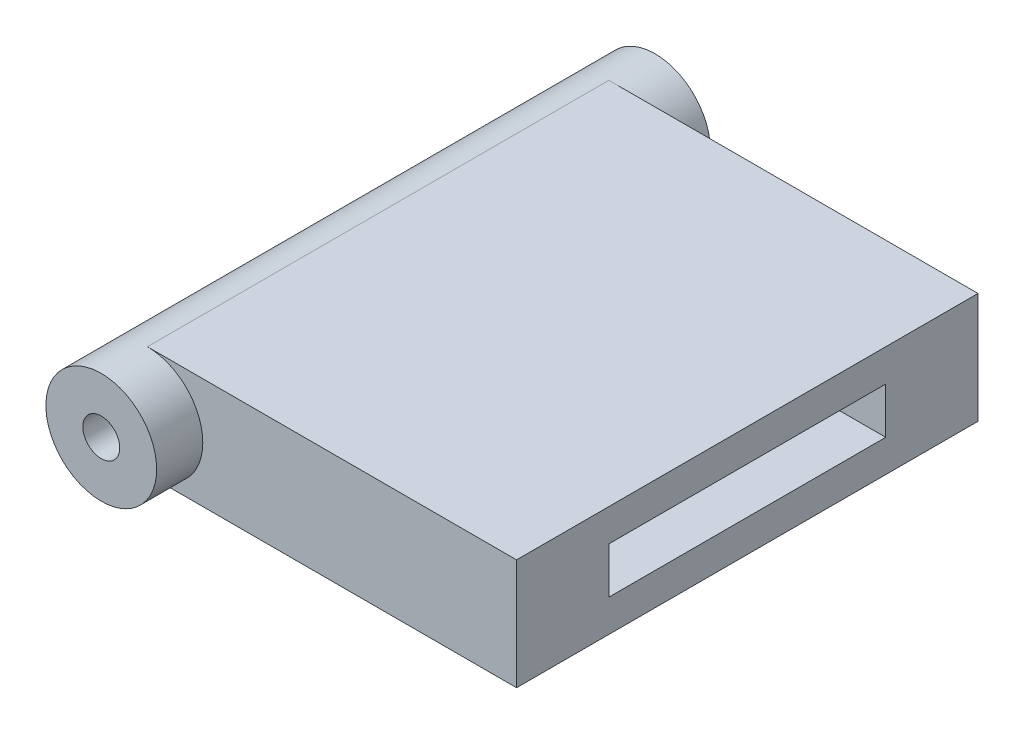
ISO-10303-21;
HEADER;
FILE_DESCRIPTION(('STEP AP214'),'2;1');
FILE_NAME('part.step','',(''),(''),'','','');
FILE_SCHEMA(('AUTOMOTIVE_DESIGN { 1 0 10303 214 1 1 1 1 }'));
ENDSEC;
DATA;
#1=APPLICATION_CONTEXT('core data for automotive mechanical design processes');
#2=APPLICATION_PROTOCOL_DEFINITION('international standard','automotive_design',2000,#1);
#3=PRODUCT_CONTEXT('',#1,'mechanical');
#4=PRODUCT('Part','Part','',(#3));
#5=PRODUCT_RELATED_PRODUCT_CATEGORY('part','',(#4));
#6=PRODUCT_DEFINITION_FORMATION('','',#4);
#7=PRODUCT_DEFINITION_CONTEXT('part definition',#1,'design');
#8=PRODUCT_DEFINITION('design','',#6,#7);
#9=PRODUCT_DEFINITION_SHAPE('','',#8);
#10=(LENGTH_UNIT() NAMED_UNIT(*) SI_UNIT(.MILLI.,.METRE.));
#11=(NAMED_UNIT(*) PLANE_ANGLE_UNIT() SI_UNIT($,.RADIAN.));
#12=(NAMED_UNIT(*) SI_UNIT($,.STERADIAN.) SOLID_ANGLE_UNIT());
#13=UNCERTAINTY_MEASURE_WITH_UNIT(LENGTH_MEASURE(1.E-05),#10,'distance_accuracy_value','');
#14=(GEOMETRIC_REPRESENTATION_CONTEXT(3) GLOBAL_UNCERTAINTY_ASSIGNED_CONTEXT((#13)) GLOBAL_UNIT_ASSIGNED_CONTEXT((#10,
#11,#12)) REPRESENTATION_CONTEXT('',''));
#15=CARTESIAN_POINT('',(0.,0.,0.));
#16=DIRECTION('',(0.,0.,1.));
#17=DIRECTION('',(1.,0.,0.));
#18=AXIS2_PLACEMENT_3D('',#15,#16,#17);
#19=CARTESIAN_POINT('',(0.,0.,76.2));
#20=DIRECTION('',(0.,0.,-1.));
#21=DIRECTION('',(-1.,0.,0.));
#22=AXIS2_PLACEMENT_3D('',#19,#20,#21);
#23=CYLINDRICAL_SURFACE('',#22,2.54);
#24=CARTESIAN_POINT('',(0.,0.,76.2));
#25=DIRECTION('',(0.,0.,1.));
#26=DIRECTION('',(1.,0.,0.));
#27=AXIS2_PLACEMENT_3D('',#24,#25,#26);
#28=CIRCLE('',#27,2.54);
#29=CARTESIAN_POINT('',(-2.54,0.,76.2));
#30=VERTEX_POINT('',#29);
#31=EDGE_CURVE('E204',#30,#30,#28,.T.);
#32=CARTESIAN_POINT('',(0.,0.,0.));
#33=DIRECTION('',(0.,0.,1.));
#34=DIRECTION('',(1.,0.,0.));
#35=AXIS2_PLACEMENT_3D('',#32,#33,#34);
#36=CIRCLE('',#35,2.54);
#37=CARTESIAN_POINT('',(-2.54,0.,0.));
#38=VERTEX_POINT('',#37);
#39=EDGE_CURVE('E203',#38,#38,#36,.T.);
#40=CARTESIAN_POINT('',(-2.54,0.,76.2));
#41=CARTESIAN_POINT('',(-2.54,0.,75.40625));
#42=CARTESIAN_POINT('',(-2.54,0.,74.6125));
#43=CARTESIAN_POINT('',(-2.54,0.,73.025));
#44=CARTESIAN_POINT('',(-2.54,0.,72.23125));
#45=CARTESIAN_POINT('',(-2.54,0.,70.64375));
#46=CARTESIAN_POINT('',(-2.54,0.,69.85));
#47=CARTESIAN_POINT('',(-2.54,0.,68.2625));
#48=CARTESIAN_POINT('',(-2.54,0.,67.46875));
#49=CARTESIAN_POINT('',(-2.54,0.,65.88125));
#50=CARTESIAN_POINT('',(-2.54,0.,65.0875));
#51=CARTESIAN_POINT('',(-2.54,0.,63.5));
#52=CARTESIAN_POINT('',(-2.54,0.,62.70625));
#53=CARTESIAN_POINT('',(-2.54,0.,61.11875));
#54=CARTESIAN_POINT('',(-2.54,0.,60.325));
#55=CARTESIAN_POINT('',(-2.54,0.,58.7375));
#56=CARTESIAN_POINT('',(-2.54,0.,57.94375));
#57=CARTESIAN_POINT('',(-2.54,0.,56.35625));
#58=CARTESIAN_POINT('',(-2.54,0.,55.5625));
#59=CARTESIAN_POINT('',(-2.54,0.,53.975));
#60=CARTESIAN_POINT('',(-2.54,0.,53.18125));
#61=CARTESIAN_POINT('',(-2.54,0.,51.59375));
#62=CARTESIAN_POINT('',(-2.54,0.,50.8));
#63=CARTESIAN_POINT('',(-2.54,0.,49.2125));
#64=CARTESIAN_POINT('',(-2.54,0.,48.41875));
#65=CARTESIAN_POINT('',(-2.54,0.,46.83125));
#66=CARTESIAN_POINT('',(-2.54,0.,46.0375));
#67=CARTESIAN_POINT('',(-2.54,0.,44.45));
#68=CARTESIAN_POINT('',(-2.54,0.,43.65625));
#69=CARTESIAN_POINT('',(-2.54,0.,42.06875));
#70=CARTESIAN_POINT('',(-2.54,0.,41.275));
#71=CARTESIAN_POINT('',(-2.54,0.,39.6875));
#72=CARTESIAN_POINT('',(-2.54,0.,38.89375));
#73=CARTESIAN_POINT('',(-2.54,0.,37.30625));
#74=CARTESIAN_POINT('',(-2.54,0.,36.5125));
#75=CARTESIAN_POINT('',(-2.54,0.,34.925));
#76=CARTESIAN_POINT('',(-2.54,0.,34.13125));
#77=CARTESIAN_POINT('',(-2.54,0.,32.54375));
#78=CARTESIAN_POINT('',(-2.54,0.,31.75));
#79=CARTESIAN_POINT('',(-2.54,0.,30.1625));
#80=CARTESIAN_POINT('',(-2.54,0.,29.36875));
#81=CARTESIAN_POINT('',(-2.54,0.,27.78125));
#82=CARTESIAN_POINT('',(-2.54,0.,26.9875));
#83=CARTESIAN_POINT('',(-2.54,0.,25.4));
#84=CARTESIAN_POINT('',(-2.54,0.,24.60625));
#85=CARTESIAN_POINT('',(-2.54,0.,23.01875));
#86=CARTESIAN_POINT('',(-2.54,0.,22.225));
#87=CARTESIAN_POINT('',(-2.54,0.,20.6375));
#88=CARTESIAN_POINT('',(-2.54,0.,19.84375));
#89=CARTESIAN_POINT('',(-2.54,0.,18.25625));
#90=CARTESIAN_POINT('',(-2.54,0.,17.4625));
#91=CARTESIAN_POINT('',(-2.54,0.,15.875));
#92=CARTESIAN_POINT('',(-2.54,0.,15.08125));
#93=CARTESIAN_POINT('',(-2.54,0.,13.49375));
#94=CARTESIAN_POINT('',(-2.54,0.,12.7));
#95=CARTESIAN_POINT('',(-2.54,0.,11.1125));
#96=CARTESIAN_POINT('',(-2.54,0.,10.31875));
#97=CARTESIAN_POINT('',(-2.54,0.,8.73125));
#98=CARTESIAN_POINT('',(-2.54,0.,7.93750000000001));
#99=CARTESIAN_POINT('',(-2.54,0.,6.35));
#100=CARTESIAN_POINT('',(-2.54,0.,5.55625));
#101=CARTESIAN_POINT('',(-2.54,0.,3.96875));
#102=CARTESIAN_POINT('',(-2.54,0.,3.175));
#103=CARTESIAN_POINT('',(-2.54,0.,1.5875));
#104=CARTESIAN_POINT('',(-2.54,0.,0.793750000000001));
#105=CARTESIAN_POINT('',(-2.54,0.,0.));
#106=B_SPLINE_CURVE_WITH_KNOTS('',3,(#40,#41,#42,#43,#44,#45,#46,#47,#48,#49,#50,#51,#52,#53,
#54,#55,#56,#57,#58,#59,#60,#61,#62,#63,#64,#65,#66,#67,#68,#69,#70,#71,#72,#73,#74,#75,#76,#77,
#78,#79,#80,#81,#82,#83,#84,#85,#86,#87,#88,#89,#90,#91,#92,#93,#94,#95,#96,#97,#98,#99,#100,
#101,#102,#103,#104,#105),.UNSPECIFIED.,.F.,.F.,(4,2,2,2,2,2,2,2,2,2,2,2,2,2,2,2,2,2,2,2,2,2,2,
2,2,2,2,2,2,2,2,2,4),(0.,2.38124999999999,4.76249999999999,7.14374999999999,9.52499999999999,
11.90625,14.2875,16.66875,19.05,21.43125,23.8125,26.19375,28.575,30.95625,33.3375,35.71875,38.1,
40.48125,42.8625,45.24375,47.625,50.00625,52.3875,54.76875,57.15,59.53125,61.9125,64.29375,
66.675,69.05625,71.4375,73.81875,76.2),.UNSPECIFIED.);
#107=EDGE_CURVE('BSEAM45',#30,#38,#106,.T.);
#108=ORIENTED_EDGE('',*,*,#31,.T.);
#109=ORIENTED_EDGE('',*,*,#39,.F.);
#110=ORIENTED_EDGE('',*,*,#107,.T.);
#111=ORIENTED_EDGE('',*,*,#107,.F.);
#112=EDGE_LOOP('',(#108,#110,#109,#111));
#113=FACE_BOUND('',#112,.T.);
#114=ADVANCED_FACE('F45',(#113),#23,.F.);
#115=CARTESIAN_POINT('',(0.,0.,76.2));
#116=DIRECTION('',(0.,0.,1.));
#117=DIRECTION('',(1.,0.,0.));
#118=AXIS2_PLACEMENT_3D('',#115,#116,#117);
#119=PLANE('',#118);
#120=CARTESIAN_POINT('',(0.,0.,76.2));
#121=DIRECTION('',(0.,0.,1.));
#122=DIRECTION('',(1.,0.,0.));
#123=AXIS2_PLACEMENT_3D('',#120,#121,#122);
#124=CIRCLE('',#123,7.62);
#125=CARTESIAN_POINT('',(7.62,0.,76.2));
#126=VERTEX_POINT('',#125);
#127=EDGE_CURVE('E11',#126,#126,#124,.T.);
#128=ORIENTED_EDGE('',*,*,#127,.T.);
#129=EDGE_LOOP('',(#128));
#130=FACE_BOUND('',#129,.T.);
#131=ORIENTED_EDGE('',*,*,#31,.F.);
#132=EDGE_LOOP('',(#131));
#133=FACE_BOUND('',#132,.T.);
#134=ADVANCED_FACE('F215',(#130,#133),#119,.T.);
#135=CARTESIAN_POINT('',(0.,0.,0.));
#136=DIRECTION('',(0.,0.,1.));
#137=DIRECTION('',(1.,0.,0.));
#138=AXIS2_PLACEMENT_3D('',#135,#136,#137);
#139=PLANE('',#138);
#140=CARTESIAN_POINT('',(0.,0.,0.));
#141=DIRECTION('',(0.,0.,1.));
#142=DIRECTION('',(1.,0.,0.));
#143=AXIS2_PLACEMENT_3D('',#140,#141,#142);
#144=CIRCLE('',#143,7.62);
#145=CARTESIAN_POINT('',(7.62,0.,0.));
#146=VERTEX_POINT('',#145);
#147=EDGE_CURVE('E49',#146,#146,#144,.T.);
#148=ORIENTED_EDGE('',*,*,#147,.F.);
#149=EDGE_LOOP('',(#148));
#150=FACE_BOUND('',#149,.T.);
#151=ORIENTED_EDGE('',*,*,#39,.T.);
#152=EDGE_LOOP('',(#151));
#153=FACE_BOUND('',#152,.T.);
#154=ADVANCED_FACE('F212',(#150,#153),#139,.F.);
#155=CARTESIAN_POINT('',(0.,0.,76.2));
#156=DIRECTION('',(0.,0.,-1.));
#157=DIRECTION('',(-1.,0.,0.));
#158=AXIS2_PLACEMENT_3D('',#155,#156,#157);
#159=CYLINDRICAL_SURFACE('',#158,7.62);
#160=DIRECTION('',(0.,0.,1.));
#161=VECTOR('',#160,1.);
#162=CARTESIAN_POINT('',(0.,7.62,0.));
#163=LINE('',#162,#161);
#164=CARTESIAN_POINT('',(0.,7.62,6.35000000000002));
#165=VERTEX_POINT('',#164);
#166=CARTESIAN_POINT('',(0.,7.62,69.85));
#167=VERTEX_POINT('',#166);
#168=EDGE_CURVE('E156',#165,#167,#163,.T.);
#169=ORIENTED_EDGE('',*,*,#168,.F.);
#170=CARTESIAN_POINT('',(0.,0.,6.35000000000002));
#171=DIRECTION('',(0.,0.,-1.));
#172=DIRECTION('',(-1.,0.,0.));
#173=AXIS2_PLACEMENT_3D('',#170,#171,#172);
#174=CIRCLE('',#173,7.62);
#175=CARTESIAN_POINT('',(0.,-7.62,6.35000000000002));
#176=VERTEX_POINT('',#175);
#177=EDGE_CURVE('E69',#165,#176,#174,.T.);
#178=ORIENTED_EDGE('',*,*,#177,.T.);
#179=DIRECTION('',(0.,0.,-1.));
#180=VECTOR('',#179,1.);
#181=CARTESIAN_POINT('',(0.,-7.62,0.));
#182=LINE('',#181,#180);
#183=CARTESIAN_POINT('',(0.,-7.62,69.85));
#184=VERTEX_POINT('',#183);
#185=EDGE_CURVE('E167',#184,#176,#182,.T.);
#186=ORIENTED_EDGE('',*,*,#185,.F.);
#187=CARTESIAN_POINT('',(0.,0.,69.85));
#188=DIRECTION('',(0.,0.,-1.));
#189=DIRECTION('',(-1.,0.,0.));
#190=AXIS2_PLACEMENT_3D('',#187,#188,#189);
#191=CIRCLE('',#190,7.62);
#192=EDGE_CURVE('E197',#167,#184,#191,.T.);
#193=ORIENTED_EDGE('',*,*,#192,.F.);
#194=EDGE_LOOP('',(#169,#178,#186,#193));
#195=FACE_BOUND('',#194,.T.);
#196=ORIENTED_EDGE('',*,*,#127,.F.);
#197=EDGE_LOOP('',(#196));
#198=FACE_BOUND('',#197,.T.);
#199=ORIENTED_EDGE('',*,*,#147,.T.);
#200=EDGE_LOOP('',(#199));
#201=FACE_BOUND('',#200,.T.);
#202=ADVANCED_FACE('F47',(#195,#198,#201),#159,.T.);
#203=CARTESIAN_POINT('',(50.8,0.,6.35000000000002));
#204=DIRECTION('',(0.,0.,-1.));
#205=DIRECTION('',(-1.,0.,0.));
#206=AXIS2_PLACEMENT_3D('',#203,#204,#205);
#207=PLANE('',#206);
#208=ORIENTED_EDGE('',*,*,#177,.F.);
#209=DIRECTION('',(-1.,0.,0.));
#210=VECTOR('',#209,1.);
#211=CARTESIAN_POINT('',(50.8,7.62,6.35000000000002));
#212=LINE('',#211,#210);
#213=CARTESIAN_POINT('',(50.8,7.62,6.35000000000002));
#214=VERTEX_POINT('',#213);
#215=EDGE_CURVE('E193',#214,#165,#212,.T.);
#216=ORIENTED_EDGE('',*,*,#215,.F.);
#217=DIRECTION('',(0.,-1.,0.));
#218=VECTOR('',#217,1.);
#219=CARTESIAN_POINT('',(50.8,0.,6.35000000000002));
#220=LINE('',#219,#218);
#221=CARTESIAN_POINT('',(50.8,-7.62,6.35000000000002));
#222=VERTEX_POINT('',#221);
#223=EDGE_CURVE('E162',#214,#222,#220,.T.);
#224=ORIENTED_EDGE('',*,*,#223,.T.);
#225=DIRECTION('',(-1.,0.,0.));
#226=VECTOR('',#225,1.);
#227=CARTESIAN_POINT('',(50.8,-7.62,6.35000000000002));
#228=LINE('',#227,#226);
#229=EDGE_CURVE('E176',#222,#176,#228,.T.);
#230=ORIENTED_EDGE('',*,*,#229,.T.);
#231=EDGE_LOOP('',(#208,#216,#224,#230));
#232=FACE_BOUND('',#231,.T.);
#233=ADVANCED_FACE('F224',(#232),#207,.T.);
#234=CARTESIAN_POINT('',(50.8,7.62,0.));
#235=DIRECTION('',(0.,-1.,0.));
#236=DIRECTION('',(0.,0.,-1.));
#237=AXIS2_PLACEMENT_3D('',#234,#235,#236);
#238=PLANE('',#237);
#239=ORIENTED_EDGE('',*,*,#168,.T.);
#240=DIRECTION('',(-1.,0.,0.));
#241=VECTOR('',#240,1.);
#242=CARTESIAN_POINT('',(50.8,7.62,69.85));
#243=LINE('',#242,#241);
#244=CARTESIAN_POINT('',(50.8,7.62,69.85));
#245=VERTEX_POINT('',#244);
#246=EDGE_CURVE('E189',#245,#167,#243,.T.);
#247=ORIENTED_EDGE('',*,*,#246,.F.);
#248=DIRECTION('',(0.,0.,1.));
#249=VECTOR('',#248,1.);
#250=CARTESIAN_POINT('',(50.8,7.62,0.));
#251=LINE('',#250,#249);
#252=EDGE_CURVE('E166',#214,#245,#251,.T.);
#253=ORIENTED_EDGE('',*,*,#252,.F.);
#254=ORIENTED_EDGE('',*,*,#215,.T.);
#255=EDGE_LOOP('',(#239,#247,#253,#254));
#256=FACE_BOUND('',#255,.T.);
#257=ADVANCED_FACE('F238',(#256),#238,.F.);
#258=CARTESIAN_POINT('',(50.8,0.,69.85));
#259=DIRECTION('',(0.,0.,-1.));
#260=DIRECTION('',(-1.,0.,0.));
#261=AXIS2_PLACEMENT_3D('',#258,#259,#260);
#262=PLANE('',#261);
#263=ORIENTED_EDGE('',*,*,#246,.T.);
#264=ORIENTED_EDGE('',*,*,#192,.T.);
#265=DIRECTION('',(-1.,0.,0.));
#266=VECTOR('',#265,1.);
#267=CARTESIAN_POINT('',(50.8,-7.62,69.85));
#268=LINE('',#267,#266);
#269=CARTESIAN_POINT('',(50.8,-7.62,69.85));
#270=VERTEX_POINT('',#269);
#271=EDGE_CURVE('E185',#270,#184,#268,.T.);
#272=ORIENTED_EDGE('',*,*,#271,.F.);
#273=DIRECTION('',(0.,-1.,0.));
#274=VECTOR('',#273,1.);
#275=CARTESIAN_POINT('',(50.8,0.,69.85));
#276=LINE('',#275,#274);
#277=EDGE_CURVE('E170',#245,#270,#276,.T.);
#278=ORIENTED_EDGE('',*,*,#277,.F.);
#279=EDGE_LOOP('',(#263,#264,#272,#278));
#280=FACE_BOUND('',#279,.T.);
#281=ADVANCED_FACE('F257',(#280),#262,.F.);
#282=CARTESIAN_POINT('',(50.8,-7.62,0.));
#283=DIRECTION('',(0.,1.,0.));
#284=DIRECTION('',(0.,0.,1.));
#285=AXIS2_PLACEMENT_3D('',#282,#283,#284);
#286=PLANE('',#285);
#287=ORIENTED_EDGE('',*,*,#185,.T.);
#288=ORIENTED_EDGE('',*,*,#229,.F.);
#289=DIRECTION('',(0.,0.,-1.));
#290=VECTOR('',#289,1.);
#291=CARTESIAN_POINT('',(50.8,-7.62,0.));
#292=LINE('',#291,#290);
#293=EDGE_CURVE('E173',#270,#222,#292,.T.);
#294=ORIENTED_EDGE('',*,*,#293,.F.);
#295=ORIENTED_EDGE('',*,*,#271,.T.);
#296=EDGE_LOOP('',(#287,#288,#294,#295));
#297=FACE_BOUND('',#296,.T.);
#298=ADVANCED_FACE('F255',(#297),#286,.F.);
#299=CARTESIAN_POINT('',(50.8,0.,0.));
#300=DIRECTION('',(1.,0.,0.));
#301=DIRECTION('',(0.,0.,-1.));
#302=AXIS2_PLACEMENT_3D('',#299,#300,#301);
#303=PLANE('',#302);
#304=DIRECTION('',(0.,1.,0.));
#305=VECTOR('',#304,1.);
#306=CARTESIAN_POINT('',(50.8,3.175,19.05));
#307=LINE('',#306,#305);
#308=CARTESIAN_POINT('',(50.8,-3.175,19.05));
#309=VERTEX_POINT('',#308);
#310=CARTESIAN_POINT('',(50.8,3.175,19.05));
#311=VERTEX_POINT('',#310);
#312=EDGE_CURVE('E61',#309,#311,#307,.T.);
#313=ORIENTED_EDGE('',*,*,#312,.F.);
#314=DIRECTION('',(0.,0.,-1.));
#315=VECTOR('',#314,1.);
#316=CARTESIAN_POINT('',(50.8,-3.17500000000002,57.15));
#317=LINE('',#316,#315);
#318=CARTESIAN_POINT('',(50.8,-3.17500000000002,57.15));
#319=VERTEX_POINT('',#318);
#320=EDGE_CURVE('E134',#319,#309,#317,.T.);
#321=ORIENTED_EDGE('',*,*,#320,.F.);
#322=DIRECTION('',(0.,-1.,0.));
#323=VECTOR('',#322,1.);
#324=CARTESIAN_POINT('',(50.8,3.17499999999998,57.15));
#325=LINE('',#324,#323);
#326=CARTESIAN_POINT('',(50.8,3.17499999999998,57.15));
#327=VERTEX_POINT('',#326);
#328=EDGE_CURVE('E138',#327,#319,#325,.T.);
#329=ORIENTED_EDGE('',*,*,#328,.F.);
#330=DIRECTION('',(0.,0.,1.));
#331=VECTOR('',#330,1.);
#332=CARTESIAN_POINT('',(50.8,3.17499999999998,57.15));
#333=LINE('',#332,#331);
#334=EDGE_CURVE('E147',#311,#327,#333,.T.);
#335=ORIENTED_EDGE('',*,*,#334,.F.);
#336=EDGE_LOOP('',(#313,#321,#329,#335));
#337=FACE_BOUND('',#336,.T.);
#338=ORIENTED_EDGE('',*,*,#223,.F.);
#339=ORIENTED_EDGE('',*,*,#252,.T.);
#340=ORIENTED_EDGE('',*,*,#277,.T.);
#341=ORIENTED_EDGE('',*,*,#293,.T.);
#342=EDGE_LOOP('',(#338,#339,#340,#341));
#343=FACE_BOUND('',#342,.T.);
#344=ADVANCED_FACE('F251',(#337,#343),#303,.T.);
#345=CARTESIAN_POINT('',(25.4,3.175,19.05));
#346=DIRECTION('',(0.,0.,-1.));
#347=DIRECTION('',(-1.,0.,0.));
#348=AXIS2_PLACEMENT_3D('',#345,#346,#347);
#349=PLANE('',#348);
#350=ORIENTED_EDGE('',*,*,#312,.T.);
#351=DIRECTION('',(1.,0.,0.));
#352=VECTOR('',#351,1.);
#353=CARTESIAN_POINT('',(25.4,3.175,19.05));
#354=LINE('',#353,#352);
#355=CARTESIAN_POINT('',(25.4,3.175,19.05));
#356=VERTEX_POINT('',#355);
#357=EDGE_CURVE('E109',#356,#311,#354,.T.);
#358=ORIENTED_EDGE('',*,*,#357,.F.);
#359=DIRECTION('',(0.,1.,0.));
#360=VECTOR('',#359,1.);
#361=CARTESIAN_POINT('',(25.4,3.175,19.05));
#362=LINE('',#361,#360);
#363=CARTESIAN_POINT('',(25.4,-3.175,19.05));
#364=VERTEX_POINT('',#363);
#365=EDGE_CURVE('E113',#364,#356,#362,.T.);
#366=ORIENTED_EDGE('',*,*,#365,.F.);
#367=DIRECTION('',(1.,0.,0.));
#368=VECTOR('',#367,1.);
#369=CARTESIAN_POINT('',(25.4,-3.175,19.05));
#370=LINE('',#369,#368);
#371=EDGE_CURVE('E153',#364,#309,#370,.T.);
#372=ORIENTED_EDGE('',*,*,#371,.T.);
#373=EDGE_LOOP('',(#350,#358,#366,#372));
#374=FACE_BOUND('',#373,.T.);
#375=ADVANCED_FACE('F111',(#374),#349,.F.);
#376=CARTESIAN_POINT('',(25.4,-3.17500000000002,57.15));
#377=DIRECTION('',(0.,-1.,0.));
#378=DIRECTION('',(0.,0.,-1.));
#379=AXIS2_PLACEMENT_3D('',#376,#377,#378);
#380=PLANE('',#379);
#381=ORIENTED_EDGE('',*,*,#320,.T.);
#382=ORIENTED_EDGE('',*,*,#371,.F.);
#383=DIRECTION('',(0.,0.,-1.));
#384=VECTOR('',#383,1.);
#385=CARTESIAN_POINT('',(25.4,-3.17500000000002,57.15));
#386=LINE('',#385,#384);
#387=CARTESIAN_POINT('',(25.4,-3.17500000000002,57.15));
#388=VERTEX_POINT('',#387);
#389=EDGE_CURVE('E120',#388,#364,#386,.T.);
#390=ORIENTED_EDGE('',*,*,#389,.F.);
#391=DIRECTION('',(1.,0.,0.));
#392=VECTOR('',#391,1.);
#393=CARTESIAN_POINT('',(25.4,-3.17500000000002,57.15));
#394=LINE('',#393,#392);
#395=EDGE_CURVE('E157',#388,#319,#394,.T.);
#396=ORIENTED_EDGE('',*,*,#395,.T.);
#397=EDGE_LOOP('',(#381,#382,#390,#396));
#398=FACE_BOUND('',#397,.T.);
#399=ADVANCED_FACE('F271',(#398),#380,.F.);
#400=CARTESIAN_POINT('',(25.4,3.17499999999998,57.15));
#401=DIRECTION('',(0.,0.,1.));
#402=DIRECTION('',(1.,0.,0.));
#403=AXIS2_PLACEMENT_3D('',#400,#401,#402);
#404=PLANE('',#403);
#405=ORIENTED_EDGE('',*,*,#328,.T.);
#406=ORIENTED_EDGE('',*,*,#395,.F.);
#407=DIRECTION('',(0.,-1.,0.));
#408=VECTOR('',#407,1.);
#409=CARTESIAN_POINT('',(25.4,3.17499999999998,57.15));
#410=LINE('',#409,#408);
#411=CARTESIAN_POINT('',(25.4,3.17499999999998,57.15));
#412=VERTEX_POINT('',#411);
#413=EDGE_CURVE('E129',#412,#388,#410,.T.);
#414=ORIENTED_EDGE('',*,*,#413,.F.);
#415=DIRECTION('',(1.,0.,0.));
#416=VECTOR('',#415,1.);
#417=CARTESIAN_POINT('',(25.4,3.17499999999998,57.15));
#418=LINE('',#417,#416);
#419=EDGE_CURVE('E119',#412,#327,#418,.T.);
#420=ORIENTED_EDGE('',*,*,#419,.T.);
#421=EDGE_LOOP('',(#405,#406,#414,#420));
#422=FACE_BOUND('',#421,.T.);
#423=ADVANCED_FACE('F274',(#422),#404,.F.);
#424=CARTESIAN_POINT('',(25.4,3.17499999999998,57.15));
#425=DIRECTION('',(0.,1.,0.));
#426=DIRECTION('',(0.,0.,1.));
#427=AXIS2_PLACEMENT_3D('',#424,#425,#426);
#428=PLANE('',#427);
#429=ORIENTED_EDGE('',*,*,#334,.T.);
#430=ORIENTED_EDGE('',*,*,#419,.F.);
#431=DIRECTION('',(0.,0.,1.));
#432=VECTOR('',#431,1.);
#433=CARTESIAN_POINT('',(25.4,3.17499999999998,57.15));
#434=LINE('',#433,#432);
#435=EDGE_CURVE('E123',#356,#412,#434,.T.);
#436=ORIENTED_EDGE('',*,*,#435,.F.);
#437=ORIENTED_EDGE('',*,*,#357,.T.);
#438=EDGE_LOOP('',(#429,#430,#436,#437));
#439=FACE_BOUND('',#438,.T.);
#440=ADVANCED_FACE('F124',(#439),#428,.F.);
#441=CARTESIAN_POINT('',(25.4,0.,0.));
#442=DIRECTION('',(1.,0.,0.));
#443=DIRECTION('',(0.,0.,-1.));
#444=AXIS2_PLACEMENT_3D('',#441,#442,#443);
#445=PLANE('',#444);
#446=ORIENTED_EDGE('',*,*,#365,.T.);
#447=ORIENTED_EDGE('',*,*,#435,.T.);
#448=ORIENTED_EDGE('',*,*,#413,.T.);
#449=ORIENTED_EDGE('',*,*,#389,.T.);
#450=EDGE_LOOP('',(#446,#447,#448,#449));
#451=FACE_BOUND('',#450,.T.);
#452=ADVANCED_FACE('F131',(#451),#445,.T.);
#453=CLOSED_SHELL('',(#114,#134,#154,#202,#233,#257,#281,#298,#344,#375,#399,#423,#440,#452));
#454=MANIFOLD_SOLID_BREP('B2',#453);
#455=ADVANCED_BREP_SHAPE_REPRESENTATION('',(#18,#454),#14);
#456=SHAPE_DEFINITION_REPRESENTATION(#9,#455);
ENDSEC;
END-ISO-10303-21;
